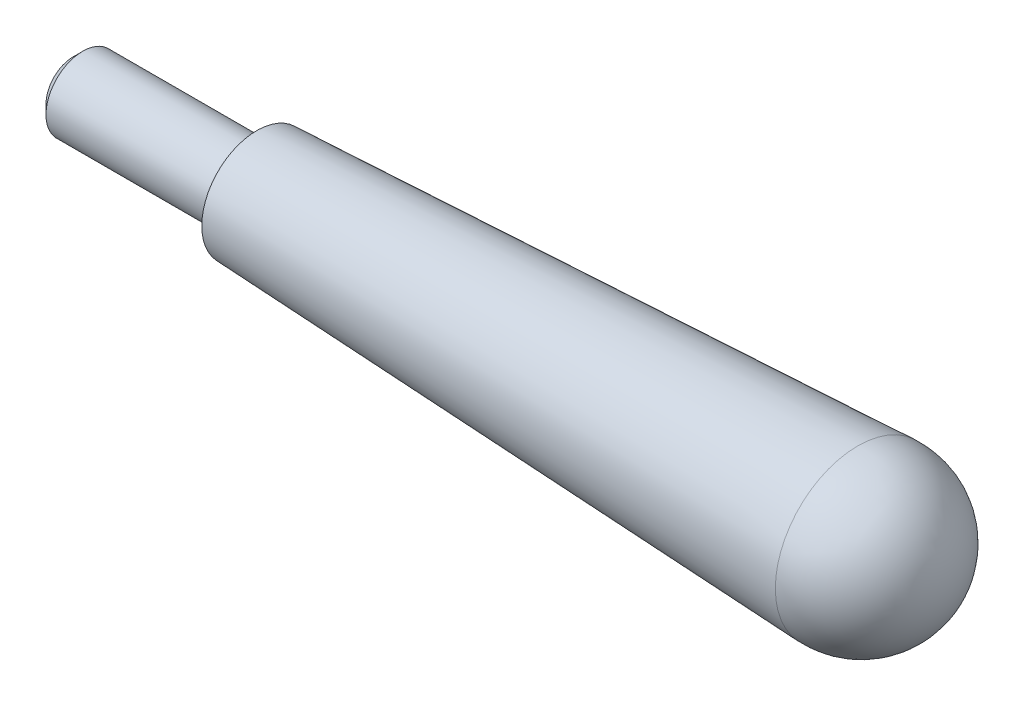
ISO-10303-21;
HEADER;
FILE_DESCRIPTION(('STEP AP214'),'2;1');
FILE_NAME('part.step','',(''),(''),'','','');
FILE_SCHEMA(('AUTOMOTIVE_DESIGN { 1 0 10303 214 1 1 1 1 }'));
ENDSEC;
DATA;
#1=APPLICATION_CONTEXT('core data for automotive mechanical design processes');
#2=APPLICATION_PROTOCOL_DEFINITION('international standard','automotive_design',2000,#1);
#3=PRODUCT_CONTEXT('',#1,'mechanical');
#4=PRODUCT('Part','Part','',(#3));
#5=PRODUCT_RELATED_PRODUCT_CATEGORY('part','',(#4));
#6=PRODUCT_DEFINITION_FORMATION('','',#4);
#7=PRODUCT_DEFINITION_CONTEXT('part definition',#1,'design');
#8=PRODUCT_DEFINITION('design','',#6,#7);
#9=PRODUCT_DEFINITION_SHAPE('','',#8);
#10=(LENGTH_UNIT() NAMED_UNIT(*) SI_UNIT(.MILLI.,.METRE.));
#11=(NAMED_UNIT(*) PLANE_ANGLE_UNIT() SI_UNIT($,.RADIAN.));
#12=(NAMED_UNIT(*) SI_UNIT($,.STERADIAN.) SOLID_ANGLE_UNIT());
#13=UNCERTAINTY_MEASURE_WITH_UNIT(LENGTH_MEASURE(1.E-05),#10,'distance_accuracy_value','');
#14=(GEOMETRIC_REPRESENTATION_CONTEXT(3) GLOBAL_UNCERTAINTY_ASSIGNED_CONTEXT((#13)) GLOBAL_UNIT_ASSIGNED_CONTEXT((#10,
#11,#12)) REPRESENTATION_CONTEXT('',''));
#15=CARTESIAN_POINT('',(0.,0.,0.));
#16=DIRECTION('',(0.,0.,1.));
#17=DIRECTION('',(1.,0.,0.));
#18=AXIS2_PLACEMENT_3D('',#15,#16,#17);
#19=CARTESIAN_POINT('',(0.,0.,0.));
#20=DIRECTION('',(1.,0.,0.));
#21=DIRECTION('',(0.,0.,-1.));
#22=AXIS2_PLACEMENT_3D('',#19,#20,#21);
#23=PLANE('',#22);
#24=CARTESIAN_POINT('',(0.,0.,0.));
#25=DIRECTION('',(1.,0.,0.));
#26=DIRECTION('',(0.,0.,-1.));
#27=AXIS2_PLACEMENT_3D('',#24,#25,#26);
#28=CIRCLE('',#27,3.);
#29=CARTESIAN_POINT('',(0.,0.,-3.));
#30=VERTEX_POINT('',#29);
#31=EDGE_CURVE('E42',#30,#30,#28,.F.);
#32=ORIENTED_EDGE('',*,*,#31,.T.);
#33=EDGE_LOOP('',(#32));
#34=FACE_BOUND('',#33,.T.);
#35=ADVANCED_FACE('F35',(#34),#23,.F.);
#36=CARTESIAN_POINT('',(86.,0.,0.));
#37=DIRECTION('',(-1.,0.,0.));
#38=DIRECTION('',(0.,1.,0.));
#39=AXIS2_PLACEMENT_3D('',#36,#37,#38);
#40=SPHERICAL_SURFACE('',#39,9.);
#41=CARTESIAN_POINT('',(85.5900599084187,0.,0.));
#42=DIRECTION('',(-1.,0.,0.));
#43=DIRECTION('',(0.,0.,1.));
#44=AXIS2_PLACEMENT_3D('',#41,#42,#43);
#45=CIRCLE('',#44,8.99065899260529);
#46=CARTESIAN_POINT('',(85.5900599084187,0.,8.99065899260529));
#47=VERTEX_POINT('',#46);
#48=EDGE_CURVE('E46',#47,#47,#45,.T.);
#49=ORIENTED_EDGE('',*,*,#48,.F.);
#50=EDGE_LOOP('',(#49));
#51=FACE_BOUND('',#50,.T.);
#52=ADVANCED_FACE('F70',(#51),#40,.T.);
#53=CARTESIAN_POINT('',(85.5900599084187,0.,0.));
#54=DIRECTION('',(1.,0.,0.));
#55=DIRECTION('',(0.,0.,-1.));
#56=AXIS2_PLACEMENT_3D('',#53,#54,#55);
#57=CONICAL_SURFACE('',#56,8.99065899260529,0.0455646638541873);
#58=CARTESIAN_POINT('',(20.,0.,0.));
#59=DIRECTION('',(-1.,0.,0.));
#60=DIRECTION('',(0.,0.,1.));
#61=AXIS2_PLACEMENT_3D('',#58,#59,#60);
#62=CIRCLE('',#61,6.);
#63=CARTESIAN_POINT('',(20.,0.,6.));
#64=VERTEX_POINT('',#63);
#65=EDGE_CURVE('E50',#64,#64,#62,.T.);
#66=ORIENTED_EDGE('',*,*,#65,.F.);
#67=EDGE_LOOP('',(#66));
#68=FACE_BOUND('',#67,.T.);
#69=ORIENTED_EDGE('',*,*,#48,.T.);
#70=EDGE_LOOP('',(#69));
#71=FACE_BOUND('',#70,.T.);
#72=ADVANCED_FACE('F64',(#68,#71),#57,.T.);
#73=CARTESIAN_POINT('',(20.,4.,0.));
#74=DIRECTION('',(1.,0.,0.));
#75=DIRECTION('',(0.,0.,-1.));
#76=AXIS2_PLACEMENT_3D('',#73,#74,#75);
#77=PLANE('',#76);
#78=CARTESIAN_POINT('',(20.,0.,0.));
#79=DIRECTION('',(-1.,0.,0.));
#80=DIRECTION('',(0.,0.,1.));
#81=AXIS2_PLACEMENT_3D('',#78,#79,#80);
#82=CIRCLE('',#81,4.);
#83=CARTESIAN_POINT('',(20.,0.,4.));
#84=VERTEX_POINT('',#83);
#85=EDGE_CURVE('E55',#84,#84,#82,.T.);
#86=ORIENTED_EDGE('',*,*,#85,.F.);
#87=EDGE_LOOP('',(#86));
#88=FACE_BOUND('',#87,.T.);
#89=ORIENTED_EDGE('',*,*,#65,.T.);
#90=EDGE_LOOP('',(#89));
#91=FACE_BOUND('',#90,.T.);
#92=ADVANCED_FACE('F61',(#88,#91),#77,.F.);
#93=CARTESIAN_POINT('',(0.,0.,0.));
#94=DIRECTION('',(-1.,0.,0.));
#95=DIRECTION('',(0.,0.,1.));
#96=AXIS2_PLACEMENT_3D('',#93,#94,#95);
#97=CYLINDRICAL_SURFACE('',#96,4.);
#98=CARTESIAN_POINT('',(0.999999999999984,0.,0.));
#99=DIRECTION('',(1.,0.,0.));
#100=DIRECTION('',(0.,0.,-1.));
#101=AXIS2_PLACEMENT_3D('',#98,#99,#100);
#102=CIRCLE('',#101,4.);
#103=CARTESIAN_POINT('',(0.999999999999984,0.,-4.));
#104=VERTEX_POINT('',#103);
#105=EDGE_CURVE('E10',#104,#104,#102,.T.);
#106=ORIENTED_EDGE('',*,*,#105,.T.);
#107=EDGE_LOOP('',(#106));
#108=FACE_BOUND('',#107,.T.);
#109=ORIENTED_EDGE('',*,*,#85,.T.);
#110=EDGE_LOOP('',(#109));
#111=FACE_BOUND('',#110,.T.);
#112=ADVANCED_FACE('F59',(#108,#111),#97,.T.);
#113=CARTESIAN_POINT('',(0.,0.,0.));
#114=DIRECTION('',(1.,0.,0.));
#115=DIRECTION('',(0.,0.,-1.));
#116=AXIS2_PLACEMENT_3D('',#113,#114,#115);
#117=CONICAL_SURFACE('',#116,3.,0.785398163397455);
#118=ORIENTED_EDGE('',*,*,#105,.F.);
#119=EDGE_LOOP('',(#118));
#120=FACE_BOUND('',#119,.T.);
#121=ORIENTED_EDGE('',*,*,#31,.F.);
#122=EDGE_LOOP('',(#121));
#123=FACE_BOUND('',#122,.T.);
#124=ADVANCED_FACE('F37',(#120,#123),#117,.T.);
#125=CLOSED_SHELL('',(#35,#52,#72,#92,#112,#124));
#126=MANIFOLD_SOLID_BREP('B2',#125);
#127=ADVANCED_BREP_SHAPE_REPRESENTATION('',(#18,#126),#14);
#128=SHAPE_DEFINITION_REPRESENTATION(#9,#127);
ENDSEC;
END-ISO-10303-21;
